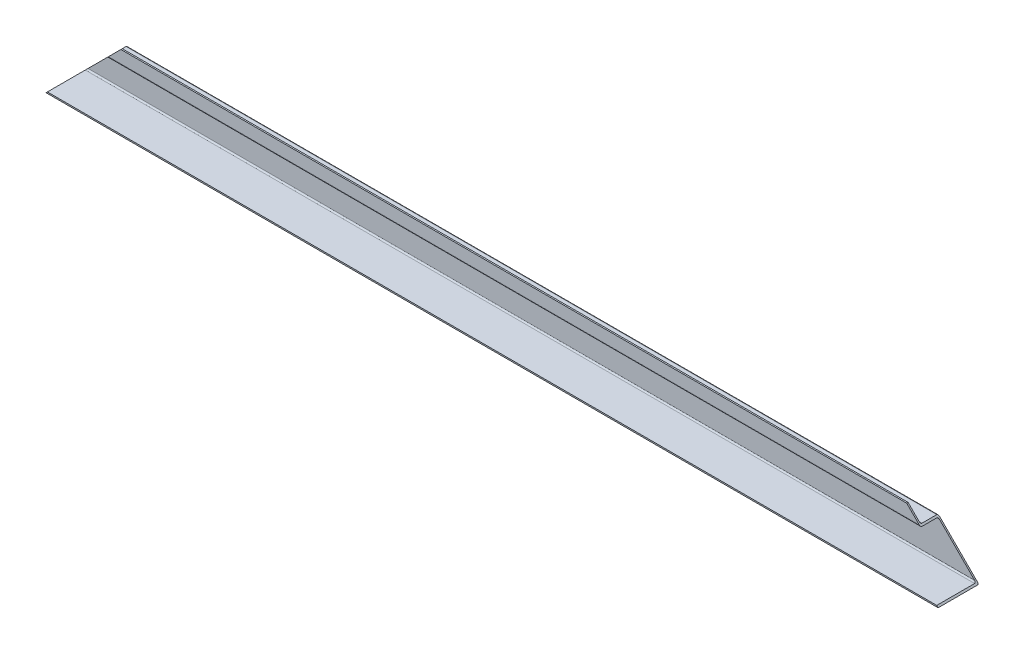
ISO-10303-21;
HEADER;
FILE_DESCRIPTION(('STEP AP214'),'2;1');
FILE_NAME('part.step','',(''),(''),'','','');
FILE_SCHEMA(('AUTOMOTIVE_DESIGN { 1 0 10303 214 1 1 1 1 }'));
ENDSEC;
DATA;
#1=APPLICATION_CONTEXT('core data for automotive mechanical design processes');
#2=APPLICATION_PROTOCOL_DEFINITION('international standard','automotive_design',2000,#1);
#3=PRODUCT_CONTEXT('',#1,'mechanical');
#4=PRODUCT('Part','Part','',(#3));
#5=PRODUCT_RELATED_PRODUCT_CATEGORY('part','',(#4));
#6=PRODUCT_DEFINITION_FORMATION('','',#4);
#7=PRODUCT_DEFINITION_CONTEXT('part definition',#1,'design');
#8=PRODUCT_DEFINITION('design','',#6,#7);
#9=PRODUCT_DEFINITION_SHAPE('','',#8);
#10=(LENGTH_UNIT() NAMED_UNIT(*) SI_UNIT(.MILLI.,.METRE.));
#11=(NAMED_UNIT(*) PLANE_ANGLE_UNIT() SI_UNIT($,.RADIAN.));
#12=(NAMED_UNIT(*) SI_UNIT($,.STERADIAN.) SOLID_ANGLE_UNIT());
#13=UNCERTAINTY_MEASURE_WITH_UNIT(LENGTH_MEASURE(1.E-05),#10,'distance_accuracy_value','');
#14=(GEOMETRIC_REPRESENTATION_CONTEXT(3) GLOBAL_UNCERTAINTY_ASSIGNED_CONTEXT((#13)) GLOBAL_UNIT_ASSIGNED_CONTEXT((#10,
#11,#12)) REPRESENTATION_CONTEXT('',''));
#15=CARTESIAN_POINT('',(0.,0.,0.));
#16=DIRECTION('',(0.,0.,1.));
#17=DIRECTION('',(1.,0.,0.));
#18=AXIS2_PLACEMENT_3D('',#15,#16,#17);
#19=CARTESIAN_POINT('',(1930.,0.,0.));
#20=DIRECTION('',(0.,0.,-1.));
#21=DIRECTION('',(-1.,0.,0.));
#22=AXIS2_PLACEMENT_3D('',#19,#20,#21);
#23=PLANE('',#22);
#24=DIRECTION('',(-1.,0.,0.));
#25=VECTOR('',#24,1.);
#26=CARTESIAN_POINT('',(1930.,0.,0.));
#27=LINE('',#26,#25);
#28=CARTESIAN_POINT('',(1927.,0.,0.));
#29=VERTEX_POINT('',#28);
#30=CARTESIAN_POINT('',(3.00000000000013,0.,0.));
#31=VERTEX_POINT('',#30);
#32=EDGE_CURVE('E165',#29,#31,#27,.T.);
#33=ORIENTED_EDGE('',*,*,#32,.T.);
#34=DIRECTION('',(-0.707106781186551,-0.707106781186544,0.));
#35=VECTOR('',#34,1.);
#36=CARTESIAN_POINT('',(0.,-3.,0.));
#37=LINE('',#36,#35);
#38=CARTESIAN_POINT('',(0.,-3.,0.));
#39=VERTEX_POINT('',#38);
#40=EDGE_CURVE('E148',#31,#39,#37,.T.);
#41=ORIENTED_EDGE('',*,*,#40,.T.);
#42=DIRECTION('',(-1.,0.,0.));
#43=VECTOR('',#42,1.);
#44=CARTESIAN_POINT('',(1930.,-3.,0.));
#45=LINE('',#44,#43);
#46=CARTESIAN_POINT('',(1930.,-3.,0.));
#47=VERTEX_POINT('',#46);
#48=EDGE_CURVE('E163',#47,#39,#45,.T.);
#49=ORIENTED_EDGE('',*,*,#48,.F.);
#50=DIRECTION('',(-0.707106781186551,0.707106781186544,0.));
#51=VECTOR('',#50,1.);
#52=CARTESIAN_POINT('',(1930.,-3.,0.));
#53=LINE('',#52,#51);
#54=EDGE_CURVE('E254',#47,#29,#53,.T.);
#55=ORIENTED_EDGE('',*,*,#54,.T.);
#56=EDGE_LOOP('',(#33,#41,#49,#55));
#57=FACE_BOUND('',#56,.T.);
#58=ADVANCED_FACE('F33',(#57),#23,.F.);
#59=CARTESIAN_POINT('',(1930.,-3.,0.));
#60=DIRECTION('',(0.,1.,0.));
#61=DIRECTION('',(0.,0.,1.));
#62=AXIS2_PLACEMENT_3D('',#59,#60,#61);
#63=PLANE('',#62);
#64=DIRECTION('',(0.,0.,-1.));
#65=VECTOR('',#64,1.);
#66=CARTESIAN_POINT('',(0.,-3.,0.));
#67=LINE('',#66,#65);
#68=CARTESIAN_POINT('',(0.,-3.,-85.));
#69=VERTEX_POINT('',#68);
#70=EDGE_CURVE('E145',#39,#69,#67,.T.);
#71=ORIENTED_EDGE('',*,*,#70,.T.);
#72=DIRECTION('',(-1.,0.,0.));
#73=VECTOR('',#72,1.);
#74=CARTESIAN_POINT('',(1930.,-3.,-85.));
#75=LINE('',#74,#73);
#76=CARTESIAN_POINT('',(1930.,-3.,-85.));
#77=VERTEX_POINT('',#76);
#78=EDGE_CURVE('E183',#69,#77,#75,.F.);
#79=ORIENTED_EDGE('',*,*,#78,.T.);
#80=DIRECTION('',(0.,0.,-1.));
#81=VECTOR('',#80,1.);
#82=CARTESIAN_POINT('',(1930.,-3.,0.));
#83=LINE('',#82,#81);
#84=EDGE_CURVE('E156',#47,#77,#83,.T.);
#85=ORIENTED_EDGE('',*,*,#84,.F.);
#86=ORIENTED_EDGE('',*,*,#48,.T.);
#87=EDGE_LOOP('',(#71,#79,#85,#86));
#88=FACE_BOUND('',#87,.T.);
#89=ADVANCED_FACE('F170',(#88),#63,.F.);
#90=CARTESIAN_POINT('',(1930.,-3.,-88.));
#91=DIRECTION('',(0.,0.,1.));
#92=DIRECTION('',(1.,0.,0.));
#93=AXIS2_PLACEMENT_3D('',#90,#91,#92);
#94=PLANE('',#93);
#95=DIRECTION('',(-1.,0.,0.));
#96=VECTOR('',#95,1.);
#97=CARTESIAN_POINT('',(1930.,0.,-88.));
#98=LINE('',#97,#96);
#99=CARTESIAN_POINT('',(1927.,0.,-88.));
#100=VERTEX_POINT('',#99);
#101=CARTESIAN_POINT('',(3.00000000000013,0.,-88.));
#102=VERTEX_POINT('',#101);
#103=EDGE_CURVE('E174',#100,#102,#98,.T.);
#104=ORIENTED_EDGE('',*,*,#103,.T.);
#105=DIRECTION('',(-0.707106781186551,-0.707106781186544,0.));
#106=VECTOR('',#105,1.);
#107=CARTESIAN_POINT('',(0.,-3.,-88.));
#108=LINE('',#107,#106);
#109=CARTESIAN_POINT('',(85.0000000000008,82.,-88.));
#110=VERTEX_POINT('',#109);
#111=EDGE_CURVE('E167',#110,#102,#108,.T.);
#112=ORIENTED_EDGE('',*,*,#111,.F.);
#113=DIRECTION('',(-1.,0.,0.));
#114=VECTOR('',#113,1.);
#115=CARTESIAN_POINT('',(1930.,82.,-88.));
#116=LINE('',#115,#114);
#117=CARTESIAN_POINT('',(1845.,82.,-88.));
#118=VERTEX_POINT('',#117);
#119=EDGE_CURVE('E171',#110,#118,#116,.F.);
#120=ORIENTED_EDGE('',*,*,#119,.T.);
#121=DIRECTION('',(-0.707106781186551,0.707106781186544,0.));
#122=VECTOR('',#121,1.);
#123=CARTESIAN_POINT('',(1930.,-3.,-88.));
#124=LINE('',#123,#122);
#125=EDGE_CURVE('E253',#100,#118,#124,.T.);
#126=ORIENTED_EDGE('',*,*,#125,.F.);
#127=EDGE_LOOP('',(#104,#112,#120,#126));
#128=FACE_BOUND('',#127,.T.);
#129=ADVANCED_FACE('F292',(#128),#94,.F.);
#130=CARTESIAN_POINT('',(1930.,85.,-88.));
#131=DIRECTION('',(0.,-1.,0.));
#132=DIRECTION('',(0.,0.,-1.));
#133=AXIS2_PLACEMENT_3D('',#130,#131,#132);
#134=PLANE('',#133);
#135=DIRECTION('',(-1.,0.,0.));
#136=VECTOR('',#135,1.);
#137=CARTESIAN_POINT('',(1930.,85.,-85.));
#138=LINE('',#137,#136);
#139=CARTESIAN_POINT('',(1842.,85.,-85.));
#140=VERTEX_POINT('',#139);
#141=CARTESIAN_POINT('',(88.0000000000007,85.,-85.));
#142=VERTEX_POINT('',#141);
#143=EDGE_CURVE('E187',#140,#142,#138,.T.);
#144=ORIENTED_EDGE('',*,*,#143,.T.);
#145=DIRECTION('',(0.,0.,1.));
#146=VECTOR('',#145,1.);
#147=CARTESIAN_POINT('',(88.0000000000007,85.,-88.));
#148=LINE('',#147,#146);
#149=CARTESIAN_POINT('',(88.0000000000007,85.,-53.));
#150=VERTEX_POINT('',#149);
#151=EDGE_CURVE('E247',#142,#150,#148,.T.);
#152=ORIENTED_EDGE('',*,*,#151,.T.);
#153=DIRECTION('',(-1.,0.,0.));
#154=VECTOR('',#153,1.);
#155=CARTESIAN_POINT('',(1930.,85.,-53.));
#156=LINE('',#155,#154);
#157=CARTESIAN_POINT('',(1842.,85.,-53.));
#158=VERTEX_POINT('',#157);
#159=EDGE_CURVE('E185',#150,#158,#156,.F.);
#160=ORIENTED_EDGE('',*,*,#159,.T.);
#161=DIRECTION('',(0.,0.,-1.));
#162=VECTOR('',#161,1.);
#163=CARTESIAN_POINT('',(1842.,85.,-88.));
#164=LINE('',#163,#162);
#165=EDGE_CURVE('E278',#158,#140,#164,.T.);
#166=ORIENTED_EDGE('',*,*,#165,.T.);
#167=EDGE_LOOP('',(#144,#152,#160,#166));
#168=FACE_BOUND('',#167,.T.);
#169=ADVANCED_FACE('F301',(#168),#134,.F.);
#170=CARTESIAN_POINT('',(1930.,85.,-50.));
#171=DIRECTION('',(0.,0.,1.));
#172=DIRECTION('',(1.,0.,0.));
#173=AXIS2_PLACEMENT_3D('',#170,#171,#172);
#174=PLANE('',#173);
#175=DIRECTION('',(-1.,0.,0.));
#176=VECTOR('',#175,1.);
#177=CARTESIAN_POINT('',(0.,88.,-50.));
#178=LINE('',#177,#176);
#179=CARTESIAN_POINT('',(1839.,88.,-50.));
#180=VERTEX_POINT('',#179);
#181=CARTESIAN_POINT('',(91.0000000000009,88.,-50.));
#182=VERTEX_POINT('',#181);
#183=EDGE_CURVE('E190',#180,#182,#178,.T.);
#184=ORIENTED_EDGE('',*,*,#183,.T.);
#185=DIRECTION('',(0.707106781186551,0.707106781186544,0.));
#186=VECTOR('',#185,1.);
#187=CARTESIAN_POINT('',(1009.00000000001,1006.,-50.));
#188=LINE('',#187,#186);
#189=CARTESIAN_POINT('',(115.000000000001,112.,-50.));
#190=VERTEX_POINT('',#189);
#191=EDGE_CURVE('E244',#182,#190,#188,.T.);
#192=ORIENTED_EDGE('',*,*,#191,.T.);
#193=DIRECTION('',(-1.,0.,0.));
#194=VECTOR('',#193,1.);
#195=CARTESIAN_POINT('',(1930.,112.,-50.));
#196=LINE('',#195,#194);
#197=CARTESIAN_POINT('',(1815.,112.,-50.));
#198=VERTEX_POINT('',#197);
#199=EDGE_CURVE('E172',#198,#190,#196,.T.);
#200=ORIENTED_EDGE('',*,*,#199,.F.);
#201=DIRECTION('',(0.707106781186551,-0.707106781186544,0.));
#202=VECTOR('',#201,1.);
#203=CARTESIAN_POINT('',(1886.,40.9999999999996,-50.));
#204=LINE('',#203,#202);
#205=EDGE_CURVE('E275',#198,#180,#204,.T.);
#206=ORIENTED_EDGE('',*,*,#205,.T.);
#207=EDGE_LOOP('',(#184,#192,#200,#206));
#208=FACE_BOUND('',#207,.T.);
#209=ADVANCED_FACE('F307',(#208),#174,.F.);
#210=CARTESIAN_POINT('',(1930.,112.,-47.));
#211=DIRECTION('',(0.,-1.,0.));
#212=DIRECTION('',(0.,0.,-1.));
#213=AXIS2_PLACEMENT_3D('',#210,#211,#212);
#214=PLANE('',#213);
#215=ORIENTED_EDGE('',*,*,#199,.T.);
#216=DIRECTION('',(0.,0.,-1.));
#217=VECTOR('',#216,1.);
#218=CARTESIAN_POINT('',(115.000000000001,112.,0.));
#219=LINE('',#218,#217);
#220=CARTESIAN_POINT('',(115.000000000001,112.,-47.));
#221=VERTEX_POINT('',#220);
#222=EDGE_CURVE('E166',#221,#190,#219,.T.);
#223=ORIENTED_EDGE('',*,*,#222,.F.);
#224=DIRECTION('',(-1.,0.,0.));
#225=VECTOR('',#224,1.);
#226=CARTESIAN_POINT('',(1930.,112.,-47.));
#227=LINE('',#226,#225);
#228=CARTESIAN_POINT('',(1815.,112.,-47.));
#229=VERTEX_POINT('',#228);
#230=EDGE_CURVE('E177',#229,#221,#227,.T.);
#231=ORIENTED_EDGE('',*,*,#230,.F.);
#232=DIRECTION('',(0.,0.,-1.));
#233=VECTOR('',#232,1.);
#234=CARTESIAN_POINT('',(1815.,112.,0.));
#235=LINE('',#234,#233);
#236=EDGE_CURVE('E219',#229,#198,#235,.T.);
#237=ORIENTED_EDGE('',*,*,#236,.T.);
#238=EDGE_LOOP('',(#215,#223,#231,#237));
#239=FACE_BOUND('',#238,.T.);
#240=ADVANCED_FACE('F310',(#239),#214,.F.);
#241=CARTESIAN_POINT('',(1930.,82.,-47.));
#242=DIRECTION('',(0.,0.,-1.));
#243=DIRECTION('',(-1.,0.,0.));
#244=AXIS2_PLACEMENT_3D('',#241,#242,#243);
#245=PLANE('',#244);
#246=ORIENTED_EDGE('',*,*,#230,.T.);
#247=DIRECTION('',(-0.707106781186551,-0.707106781186544,0.));
#248=VECTOR('',#247,1.);
#249=CARTESIAN_POINT('',(1007.50000000001,1004.5,-47.));
#250=LINE('',#249,#248);
#251=CARTESIAN_POINT('',(88.0000000000007,85.,-47.));
#252=VERTEX_POINT('',#251);
#253=EDGE_CURVE('E221',#221,#252,#250,.T.);
#254=ORIENTED_EDGE('',*,*,#253,.T.);
#255=DIRECTION('',(-1.,0.,0.));
#256=VECTOR('',#255,1.);
#257=CARTESIAN_POINT('',(1930.,85.,-47.));
#258=LINE('',#257,#256);
#259=CARTESIAN_POINT('',(1842.,85.,-47.));
#260=VERTEX_POINT('',#259);
#261=EDGE_CURVE('E55',#252,#260,#258,.F.);
#262=ORIENTED_EDGE('',*,*,#261,.T.);
#263=DIRECTION('',(-0.707106781186551,0.707106781186544,0.));
#264=VECTOR('',#263,1.);
#265=CARTESIAN_POINT('',(1887.5,39.4999999999996,-47.));
#266=LINE('',#265,#264);
#267=EDGE_CURVE('E213',#260,#229,#266,.T.);
#268=ORIENTED_EDGE('',*,*,#267,.T.);
#269=EDGE_LOOP('',(#246,#254,#262,#268));
#270=FACE_BOUND('',#269,.T.);
#271=ADVANCED_FACE('F224',(#270),#245,.F.);
#272=CARTESIAN_POINT('',(1930.,82.,-85.));
#273=DIRECTION('',(0.,1.,0.));
#274=DIRECTION('',(0.,0.,1.));
#275=AXIS2_PLACEMENT_3D('',#272,#273,#274);
#276=PLANE('',#275);
#277=DIRECTION('',(-1.,0.,0.));
#278=VECTOR('',#277,1.);
#279=CARTESIAN_POINT('',(1930.,82.,-50.));
#280=LINE('',#279,#278);
#281=CARTESIAN_POINT('',(1845.,82.,-50.));
#282=VERTEX_POINT('',#281);
#283=CARTESIAN_POINT('',(85.0000000000006,82.,-50.));
#284=VERTEX_POINT('',#283);
#285=EDGE_CURVE('E198',#282,#284,#280,.T.);
#286=ORIENTED_EDGE('',*,*,#285,.T.);
#287=DIRECTION('',(0.,0.,-1.));
#288=VECTOR('',#287,1.);
#289=CARTESIAN_POINT('',(85.0000000000009,82.,-85.));
#290=LINE('',#289,#288);
#291=CARTESIAN_POINT('',(85.0000000000009,82.,-82.));
#292=VERTEX_POINT('',#291);
#293=EDGE_CURVE('E47',#284,#292,#290,.T.);
#294=ORIENTED_EDGE('',*,*,#293,.T.);
#295=DIRECTION('',(-1.,0.,0.));
#296=VECTOR('',#295,1.);
#297=CARTESIAN_POINT('',(1930.,82.,-82.));
#298=LINE('',#297,#296);
#299=CARTESIAN_POINT('',(1845.,82.,-82.));
#300=VERTEX_POINT('',#299);
#301=EDGE_CURVE('E201',#292,#300,#298,.F.);
#302=ORIENTED_EDGE('',*,*,#301,.T.);
#303=DIRECTION('',(0.,0.,1.));
#304=VECTOR('',#303,1.);
#305=CARTESIAN_POINT('',(1845.,82.,-85.));
#306=LINE('',#305,#304);
#307=EDGE_CURVE('E211',#300,#282,#306,.T.);
#308=ORIENTED_EDGE('',*,*,#307,.T.);
#309=EDGE_LOOP('',(#286,#294,#302,#308));
#310=FACE_BOUND('',#309,.T.);
#311=ADVANCED_FACE('F217',(#310),#276,.F.);
#312=CARTESIAN_POINT('',(1930.,0.,-85.));
#313=DIRECTION('',(0.,0.,-1.));
#314=DIRECTION('',(-1.,0.,0.));
#315=AXIS2_PLACEMENT_3D('',#312,#313,#314);
#316=PLANE('',#315);
#317=DIRECTION('',(-1.,0.,0.));
#318=VECTOR('',#317,1.);
#319=CARTESIAN_POINT('',(0.,79.,-85.));
#320=LINE('',#319,#318);
#321=CARTESIAN_POINT('',(1848.,79.,-85.));
#322=VERTEX_POINT('',#321);
#323=CARTESIAN_POINT('',(82.0000000000007,79.,-85.));
#324=VERTEX_POINT('',#323);
#325=EDGE_CURVE('E195',#322,#324,#320,.T.);
#326=ORIENTED_EDGE('',*,*,#325,.T.);
#327=DIRECTION('',(-0.707106781186551,-0.707106781186544,0.));
#328=VECTOR('',#327,1.);
#329=CARTESIAN_POINT('',(966.500000000009,963.5,-85.));
#330=LINE('',#329,#328);
#331=CARTESIAN_POINT('',(6.00000000000023,3.,-85.));
#332=VERTEX_POINT('',#331);
#333=EDGE_CURVE('E229',#324,#332,#330,.T.);
#334=ORIENTED_EDGE('',*,*,#333,.T.);
#335=DIRECTION('',(-1.,0.,0.));
#336=VECTOR('',#335,1.);
#337=CARTESIAN_POINT('',(1930.,3.,-85.));
#338=LINE('',#337,#336);
#339=CARTESIAN_POINT('',(1924.,3.,-85.));
#340=VERTEX_POINT('',#339);
#341=EDGE_CURVE('E193',#332,#340,#338,.F.);
#342=ORIENTED_EDGE('',*,*,#341,.T.);
#343=DIRECTION('',(-0.707106781186551,0.707106781186544,0.));
#344=VECTOR('',#343,1.);
#345=CARTESIAN_POINT('',(1928.5,-1.50000000000001,-85.));
#346=LINE('',#345,#344);
#347=EDGE_CURVE('E263',#340,#322,#346,.T.);
#348=ORIENTED_EDGE('',*,*,#347,.T.);
#349=EDGE_LOOP('',(#326,#334,#342,#348));
#350=FACE_BOUND('',#349,.T.);
#351=ADVANCED_FACE('F348',(#350),#316,.F.);
#352=CARTESIAN_POINT('',(1930.,0.,0.));
#353=DIRECTION('',(0.,-1.,0.));
#354=DIRECTION('',(0.,0.,-1.));
#355=AXIS2_PLACEMENT_3D('',#352,#353,#354);
#356=PLANE('',#355);
#357=DIRECTION('',(-1.,0.,0.));
#358=VECTOR('',#357,1.);
#359=CARTESIAN_POINT('',(0.,0.,-82.));
#360=LINE('',#359,#358);
#361=CARTESIAN_POINT('',(1927.,0.,-82.));
#362=VERTEX_POINT('',#361);
#363=CARTESIAN_POINT('',(2.99999999999975,0.,-82.));
#364=VERTEX_POINT('',#363);
#365=EDGE_CURVE('E203',#362,#364,#360,.T.);
#366=ORIENTED_EDGE('',*,*,#365,.T.);
#367=DIRECTION('',(0.,0.,1.));
#368=VECTOR('',#367,1.);
#369=CARTESIAN_POINT('',(3.00000000000011,0.,0.));
#370=LINE('',#369,#368);
#371=EDGE_CURVE('E239',#364,#31,#370,.T.);
#372=ORIENTED_EDGE('',*,*,#371,.T.);
#373=ORIENTED_EDGE('',*,*,#32,.F.);
#374=DIRECTION('',(0.,0.,-1.));
#375=VECTOR('',#374,1.);
#376=CARTESIAN_POINT('',(1927.,0.,0.));
#377=LINE('',#376,#375);
#378=EDGE_CURVE('E269',#29,#362,#377,.T.);
#379=ORIENTED_EDGE('',*,*,#378,.T.);
#380=EDGE_LOOP('',(#366,#372,#373,#379));
#381=FACE_BOUND('',#380,.T.);
#382=ADVANCED_FACE('F330',(#381),#356,.F.);
#383=CARTESIAN_POINT('',(1930.,0.,-85.));
#384=DIRECTION('',(-1.,0.,0.));
#385=DIRECTION('',(0.,0.,1.));
#386=AXIS2_PLACEMENT_3D('',#383,#384,#385);
#387=CYLINDRICAL_SURFACE('',#386,3.);
#388=CARTESIAN_POINT('',(3.00000000000011,0.,-85.));
#389=DIRECTION('',(0.707106781186544,-0.707106781186551,0.));
#390=DIRECTION('',(-0.707106781186551,-0.707106781186544,0.));
#391=AXIS2_PLACEMENT_3D('',#388,#389,#390);
#392=ELLIPSE('',#391,4.24264068711931,3.);
#393=EDGE_CURVE('E151',#102,#69,#392,.F.);
#394=ORIENTED_EDGE('',*,*,#393,.F.);
#395=ORIENTED_EDGE('',*,*,#103,.F.);
#396=CARTESIAN_POINT('',(1927.,0.,-85.));
#397=DIRECTION('',(-0.707106781186544,-0.707106781186551,0.));
#398=DIRECTION('',(-0.707106781186551,0.707106781186544,0.));
#399=AXIS2_PLACEMENT_3D('',#396,#397,#398);
#400=ELLIPSE('',#399,4.24264068711931,3.);
#401=EDGE_CURVE('E157',#77,#100,#400,.F.);
#402=ORIENTED_EDGE('',*,*,#401,.F.);
#403=ORIENTED_EDGE('',*,*,#78,.F.);
#404=EDGE_LOOP('',(#394,#395,#402,#403));
#405=FACE_BOUND('',#404,.T.);
#406=ADVANCED_FACE('F289',(#405),#387,.T.);
#407=CARTESIAN_POINT('',(1930.,82.,-85.));
#408=DIRECTION('',(-1.,0.,0.));
#409=DIRECTION('',(0.,0.,1.));
#410=AXIS2_PLACEMENT_3D('',#407,#408,#409);
#411=CYLINDRICAL_SURFACE('',#410,3.);
#412=CARTESIAN_POINT('',(85.0000000000009,82.,-85.));
#413=DIRECTION('',(0.707106781186544,-0.707106781186551,0.));
#414=DIRECTION('',(-0.707106781186551,-0.707106781186544,0.));
#415=AXIS2_PLACEMENT_3D('',#412,#413,#414);
#416=ELLIPSE('',#415,4.24264068711931,3.);
#417=EDGE_CURVE('E250',#142,#110,#416,.F.);
#418=ORIENTED_EDGE('',*,*,#417,.F.);
#419=ORIENTED_EDGE('',*,*,#143,.F.);
#420=CARTESIAN_POINT('',(1845.,82.,-85.));
#421=DIRECTION('',(-0.707106781186544,-0.707106781186551,0.));
#422=DIRECTION('',(-0.707106781186551,0.707106781186544,0.));
#423=AXIS2_PLACEMENT_3D('',#420,#421,#422);
#424=ELLIPSE('',#423,4.24264068711931,3.);
#425=EDGE_CURVE('E281',#118,#140,#424,.F.);
#426=ORIENTED_EDGE('',*,*,#425,.F.);
#427=ORIENTED_EDGE('',*,*,#119,.F.);
#428=EDGE_LOOP('',(#418,#419,#426,#427));
#429=FACE_BOUND('',#428,.T.);
#430=ADVANCED_FACE('F299',(#429),#411,.T.);
#431=CARTESIAN_POINT('',(1930.,88.,-53.));
#432=DIRECTION('',(1.,0.,0.));
#433=DIRECTION('',(0.,0.,-1.));
#434=AXIS2_PLACEMENT_3D('',#431,#432,#433);
#435=CYLINDRICAL_SURFACE('',#434,3.);
#436=ORIENTED_EDGE('',*,*,#159,.F.);
#437=CARTESIAN_POINT('',(91.0000000000009,88.,-53.));
#438=DIRECTION('',(0.707106781186544,-0.707106781186551,0.));
#439=DIRECTION('',(0.707106781186551,0.707106781186544,0.));
#440=AXIS2_PLACEMENT_3D('',#437,#438,#439);
#441=ELLIPSE('',#440,4.24264068711931,3.);
#442=EDGE_CURVE('E241',#150,#182,#441,.F.);
#443=ORIENTED_EDGE('',*,*,#442,.T.);
#444=ORIENTED_EDGE('',*,*,#183,.F.);
#445=CARTESIAN_POINT('',(1839.,88.,-53.));
#446=DIRECTION('',(-0.707106781186544,-0.707106781186551,0.));
#447=DIRECTION('',(0.707106781186551,-0.707106781186544,0.));
#448=AXIS2_PLACEMENT_3D('',#445,#446,#447);
#449=ELLIPSE('',#448,4.24264068711931,3.);
#450=EDGE_CURVE('E272',#180,#158,#449,.F.);
#451=ORIENTED_EDGE('',*,*,#450,.T.);
#452=EDGE_LOOP('',(#436,#443,#444,#451));
#453=FACE_BOUND('',#452,.T.);
#454=ADVANCED_FACE('F305',(#453),#435,.F.);
#455=CARTESIAN_POINT('',(1930.,79.,-82.));
#456=DIRECTION('',(1.,0.,0.));
#457=DIRECTION('',(0.,0.,-1.));
#458=AXIS2_PLACEMENT_3D('',#455,#456,#457);
#459=CYLINDRICAL_SURFACE('',#458,3.);
#460=ORIENTED_EDGE('',*,*,#301,.F.);
#461=CARTESIAN_POINT('',(82.0000000000007,79.,-82.));
#462=DIRECTION('',(0.707106781186544,-0.707106781186551,0.));
#463=DIRECTION('',(0.707106781186551,0.707106781186544,0.));
#464=AXIS2_PLACEMENT_3D('',#461,#462,#463);
#465=ELLIPSE('',#464,4.24264068711931,3.);
#466=EDGE_CURVE('E226',#292,#324,#465,.F.);
#467=ORIENTED_EDGE('',*,*,#466,.T.);
#468=ORIENTED_EDGE('',*,*,#325,.F.);
#469=CARTESIAN_POINT('',(1848.,79.,-82.));
#470=DIRECTION('',(-0.707106781186544,-0.707106781186551,0.));
#471=DIRECTION('',(0.707106781186551,-0.707106781186544,0.));
#472=AXIS2_PLACEMENT_3D('',#469,#470,#471);
#473=ELLIPSE('',#472,4.24264068711931,3.);
#474=EDGE_CURVE('E261',#322,#300,#473,.F.);
#475=ORIENTED_EDGE('',*,*,#474,.T.);
#476=EDGE_LOOP('',(#460,#467,#468,#475));
#477=FACE_BOUND('',#476,.T.);
#478=ADVANCED_FACE('F335',(#477),#459,.F.);
#479=CARTESIAN_POINT('',(1930.,3.,-82.));
#480=DIRECTION('',(1.,0.,0.));
#481=DIRECTION('',(0.,0.,-1.));
#482=AXIS2_PLACEMENT_3D('',#479,#480,#481);
#483=CYLINDRICAL_SURFACE('',#482,3.);
#484=ORIENTED_EDGE('',*,*,#341,.F.);
#485=CARTESIAN_POINT('',(5.99999999999978,3.,-82.));
#486=DIRECTION('',(0.707106781186544,-0.707106781186551,0.));
#487=DIRECTION('',(0.707106781186551,0.707106781186544,0.));
#488=AXIS2_PLACEMENT_3D('',#485,#486,#487);
#489=ELLIPSE('',#488,4.24264068711931,3.);
#490=EDGE_CURVE('E236',#332,#364,#489,.F.);
#491=ORIENTED_EDGE('',*,*,#490,.T.);
#492=ORIENTED_EDGE('',*,*,#365,.F.);
#493=CARTESIAN_POINT('',(1924.,3.,-82.));
#494=DIRECTION('',(-0.707106781186544,-0.707106781186551,0.));
#495=DIRECTION('',(0.707106781186551,-0.707106781186544,0.));
#496=AXIS2_PLACEMENT_3D('',#493,#494,#495);
#497=ELLIPSE('',#496,4.24264068711931,3.);
#498=EDGE_CURVE('E266',#362,#340,#497,.F.);
#499=ORIENTED_EDGE('',*,*,#498,.T.);
#500=EDGE_LOOP('',(#484,#491,#492,#499));
#501=FACE_BOUND('',#500,.T.);
#502=ADVANCED_FACE('F337',(#501),#483,.F.);
#503=CARTESIAN_POINT('',(1930.,85.,-50.));
#504=DIRECTION('',(-1.,0.,0.));
#505=DIRECTION('',(0.,0.,1.));
#506=AXIS2_PLACEMENT_3D('',#503,#504,#505);
#507=CYLINDRICAL_SURFACE('',#506,3.);
#508=CARTESIAN_POINT('',(88.0000000000007,85.,-50.));
#509=DIRECTION('',(0.707106781186544,-0.707106781186551,0.));
#510=DIRECTION('',(-0.707106781186551,-0.707106781186544,0.));
#511=AXIS2_PLACEMENT_3D('',#508,#509,#510);
#512=ELLIPSE('',#511,4.24264068711931,3.);
#513=EDGE_CURVE('E11',#284,#252,#512,.F.);
#514=ORIENTED_EDGE('',*,*,#513,.F.);
#515=ORIENTED_EDGE('',*,*,#285,.F.);
#516=CARTESIAN_POINT('',(1842.,85.,-50.));
#517=DIRECTION('',(-0.707106781186544,-0.707106781186551,0.));
#518=DIRECTION('',(-0.707106781186551,0.707106781186544,0.));
#519=AXIS2_PLACEMENT_3D('',#516,#517,#518);
#520=ELLIPSE('',#519,4.24264068711931,3.);
#521=EDGE_CURVE('E41',#260,#282,#520,.F.);
#522=ORIENTED_EDGE('',*,*,#521,.F.);
#523=ORIENTED_EDGE('',*,*,#261,.F.);
#524=EDGE_LOOP('',(#514,#515,#522,#523));
#525=FACE_BOUND('',#524,.T.);
#526=ADVANCED_FACE('F35',(#525),#507,.T.);
#527=CARTESIAN_POINT('',(1930.,-3.,0.));
#528=DIRECTION('',(-0.707106781186544,-0.707106781186551,0.));
#529=DIRECTION('',(0.707106781186551,-0.707106781186544,0.));
#530=AXIS2_PLACEMENT_3D('',#527,#528,#529);
#531=PLANE('',#530);
#532=ORIENTED_EDGE('',*,*,#401,.T.);
#533=ORIENTED_EDGE('',*,*,#125,.T.);
#534=ORIENTED_EDGE('',*,*,#425,.T.);
#535=ORIENTED_EDGE('',*,*,#165,.F.);
#536=ORIENTED_EDGE('',*,*,#450,.F.);
#537=ORIENTED_EDGE('',*,*,#205,.F.);
#538=ORIENTED_EDGE('',*,*,#236,.F.);
#539=ORIENTED_EDGE('',*,*,#267,.F.);
#540=ORIENTED_EDGE('',*,*,#521,.T.);
#541=ORIENTED_EDGE('',*,*,#307,.F.);
#542=ORIENTED_EDGE('',*,*,#474,.F.);
#543=ORIENTED_EDGE('',*,*,#347,.F.);
#544=ORIENTED_EDGE('',*,*,#498,.F.);
#545=ORIENTED_EDGE('',*,*,#378,.F.);
#546=ORIENTED_EDGE('',*,*,#54,.F.);
#547=ORIENTED_EDGE('',*,*,#84,.T.);
#548=EDGE_LOOP('',(#532,#533,#534,#535,#536,#537,#538,#539,#540,#541,#542,#543,#544,#545,#546,#547));
#549=FACE_BOUND('',#548,.T.);
#550=ADVANCED_FACE('F210',(#549),#531,.F.);
#551=CARTESIAN_POINT('',(0.,-3.,0.));
#552=DIRECTION('',(0.707106781186544,-0.707106781186551,0.));
#553=DIRECTION('',(0.707106781186551,0.707106781186544,0.));
#554=AXIS2_PLACEMENT_3D('',#551,#552,#553);
#555=PLANE('',#554);
#556=ORIENTED_EDGE('',*,*,#393,.T.);
#557=ORIENTED_EDGE('',*,*,#70,.F.);
#558=ORIENTED_EDGE('',*,*,#40,.F.);
#559=ORIENTED_EDGE('',*,*,#371,.F.);
#560=ORIENTED_EDGE('',*,*,#490,.F.);
#561=ORIENTED_EDGE('',*,*,#333,.F.);
#562=ORIENTED_EDGE('',*,*,#466,.F.);
#563=ORIENTED_EDGE('',*,*,#293,.F.);
#564=ORIENTED_EDGE('',*,*,#513,.T.);
#565=ORIENTED_EDGE('',*,*,#253,.F.);
#566=ORIENTED_EDGE('',*,*,#222,.T.);
#567=ORIENTED_EDGE('',*,*,#191,.F.);
#568=ORIENTED_EDGE('',*,*,#442,.F.);
#569=ORIENTED_EDGE('',*,*,#151,.F.);
#570=ORIENTED_EDGE('',*,*,#417,.T.);
#571=ORIENTED_EDGE('',*,*,#111,.T.);
#572=EDGE_LOOP('',(#556,#557,#558,#559,#560,#561,#562,#563,#564,#565,#566,#567,#568,#569,#570,#571));
#573=FACE_BOUND('',#572,.T.);
#574=ADVANCED_FACE('F147',(#573),#555,.F.);
#575=CLOSED_SHELL('',(#58,#89,#129,#169,#209,#240,#271,#311,#351,#382,#406,#430,#454,#478,#502,
#526,#550,#574));
#576=MANIFOLD_SOLID_BREP('B2',#575);
#577=ADVANCED_BREP_SHAPE_REPRESENTATION('',(#18,#576),#14);
#578=SHAPE_DEFINITION_REPRESENTATION(#9,#577);
ENDSEC;
END-ISO-10303-21;
